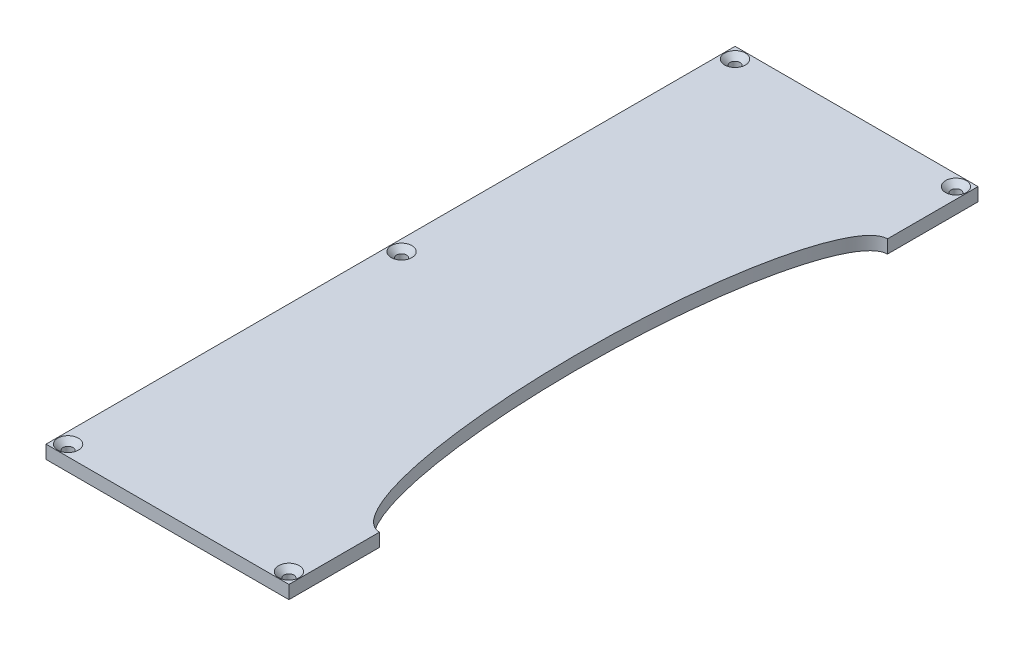
ISO-10303-21;
HEADER;
FILE_DESCRIPTION(('STEP AP214'),'2;1');
FILE_NAME('part.step','',(''),(''),'','','');
FILE_SCHEMA(('AUTOMOTIVE_DESIGN { 1 0 10303 214 1 1 1 1 }'));
ENDSEC;
DATA;
#1=APPLICATION_CONTEXT('core data for automotive mechanical design processes');
#2=APPLICATION_PROTOCOL_DEFINITION('international standard','automotive_design',2000,#1);
#3=PRODUCT_CONTEXT('',#1,'mechanical');
#4=PRODUCT('Part','Part','',(#3));
#5=PRODUCT_RELATED_PRODUCT_CATEGORY('part','',(#4));
#6=PRODUCT_DEFINITION_FORMATION('','',#4);
#7=PRODUCT_DEFINITION_CONTEXT('part definition',#1,'design');
#8=PRODUCT_DEFINITION('design','',#6,#7);
#9=PRODUCT_DEFINITION_SHAPE('','',#8);
#10=(LENGTH_UNIT() NAMED_UNIT(*) SI_UNIT(.MILLI.,.METRE.));
#11=(NAMED_UNIT(*) PLANE_ANGLE_UNIT() SI_UNIT($,.RADIAN.));
#12=(NAMED_UNIT(*) SI_UNIT($,.STERADIAN.) SOLID_ANGLE_UNIT());
#13=UNCERTAINTY_MEASURE_WITH_UNIT(LENGTH_MEASURE(1.E-05),#10,'distance_accuracy_value','');
#14=(GEOMETRIC_REPRESENTATION_CONTEXT(3) GLOBAL_UNCERTAINTY_ASSIGNED_CONTEXT((#13)) GLOBAL_UNIT_ASSIGNED_CONTEXT((#10,
#11,#12)) REPRESENTATION_CONTEXT('',''));
#15=CARTESIAN_POINT('',(0.,0.,0.));
#16=DIRECTION('',(0.,0.,1.));
#17=DIRECTION('',(1.,0.,0.));
#18=AXIS2_PLACEMENT_3D('',#15,#16,#17);
#19=CARTESIAN_POINT('',(0.,6.,0.));
#20=DIRECTION('',(0.,1.,0.));
#21=DIRECTION('',(0.,0.,-1.));
#22=AXIS2_PLACEMENT_3D('',#19,#20,#21);
#23=ELLIPSE('',#22,115.,25.);
#24=DIRECTION('',(0.,-1.,0.));
#25=VECTOR('',#24,1.);
#26=SURFACE_OF_LINEAR_EXTRUSION('',#23,#25);
#27=CARTESIAN_POINT('',(0.,0.,0.));
#28=DIRECTION('',(0.,1.,0.));
#29=DIRECTION('',(0.,0.,-1.));
#30=AXIS2_PLACEMENT_3D('',#27,#28,#29);
#31=ELLIPSE('',#30,115.,25.);
#32=CARTESIAN_POINT('',(0.,0.,-115.));
#33=VERTEX_POINT('',#32);
#34=CARTESIAN_POINT('',(0.,0.,115.));
#35=VERTEX_POINT('',#34);
#36=EDGE_CURVE('E130',#33,#35,#31,.T.);
#37=ORIENTED_EDGE('',*,*,#36,.F.);
#38=DIRECTION('',(0.,-1.,0.));
#39=VECTOR('',#38,1.);
#40=CARTESIAN_POINT('',(0.,6.,-115.));
#41=LINE('',#40,#39);
#42=CARTESIAN_POINT('',(0.,6.,-115.));
#43=VERTEX_POINT('',#42);
#44=EDGE_CURVE('E11',#43,#33,#41,.T.);
#45=ORIENTED_EDGE('',*,*,#44,.F.);
#46=CARTESIAN_POINT('',(0.,6.,115.));
#47=VERTEX_POINT('',#46);
#48=EDGE_CURVE('E148',#43,#47,#23,.T.);
#49=ORIENTED_EDGE('',*,*,#48,.T.);
#50=DIRECTION('',(0.,-1.,0.));
#51=VECTOR('',#50,1.);
#52=CARTESIAN_POINT('',(0.,6.,115.));
#53=LINE('',#52,#51);
#54=EDGE_CURVE('E90',#47,#35,#53,.T.);
#55=ORIENTED_EDGE('',*,*,#54,.T.);
#56=EDGE_LOOP('',(#37,#45,#49,#55));
#57=FACE_BOUND('',#56,.T.);
#58=ADVANCED_FACE('F41',(#57),#26,.T.);
#59=CARTESIAN_POINT('',(0.,6.,0.));
#60=DIRECTION('',(-1.,0.,0.));
#61=DIRECTION('',(0.,0.,1.));
#62=AXIS2_PLACEMENT_3D('',#59,#60,#61);
#63=PLANE('',#62);
#64=DIRECTION('',(0.,0.,-1.));
#65=VECTOR('',#64,1.);
#66=CARTESIAN_POINT('',(0.,0.,0.));
#67=LINE('',#66,#65);
#68=CARTESIAN_POINT('',(0.,0.,-156.));
#69=VERTEX_POINT('',#68);
#70=EDGE_CURVE('E134',#33,#69,#67,.T.);
#71=ORIENTED_EDGE('',*,*,#70,.T.);
#72=DIRECTION('',(0.,-1.,0.));
#73=VECTOR('',#72,1.);
#74=CARTESIAN_POINT('',(0.,6.,-156.));
#75=LINE('',#74,#73);
#76=CARTESIAN_POINT('',(0.,6.,-156.));
#77=VERTEX_POINT('',#76);
#78=EDGE_CURVE('E52',#77,#69,#75,.T.);
#79=ORIENTED_EDGE('',*,*,#78,.F.);
#80=DIRECTION('',(0.,0.,-1.));
#81=VECTOR('',#80,1.);
#82=CARTESIAN_POINT('',(0.,6.,0.));
#83=LINE('',#82,#81);
#84=EDGE_CURVE('E211',#43,#77,#83,.T.);
#85=ORIENTED_EDGE('',*,*,#84,.F.);
#86=ORIENTED_EDGE('',*,*,#44,.T.);
#87=EDGE_LOOP('',(#71,#79,#85,#86));
#88=FACE_BOUND('',#87,.T.);
#89=ADVANCED_FACE('F216',(#88),#63,.F.);
#90=CARTESIAN_POINT('',(0.,6.,-156.));
#91=DIRECTION('',(0.,0.,1.));
#92=DIRECTION('',(1.,0.,0.));
#93=AXIS2_PLACEMENT_3D('',#90,#91,#92);
#94=PLANE('',#93);
#95=DIRECTION('',(-1.,0.,0.));
#96=VECTOR('',#95,1.);
#97=CARTESIAN_POINT('',(0.,0.,-156.));
#98=LINE('',#97,#96);
#99=CARTESIAN_POINT('',(-110.,0.,-156.));
#100=VERTEX_POINT('',#99);
#101=EDGE_CURVE('E138',#69,#100,#98,.T.);
#102=ORIENTED_EDGE('',*,*,#101,.T.);
#103=DIRECTION('',(0.,-1.,0.));
#104=VECTOR('',#103,1.);
#105=CARTESIAN_POINT('',(-110.,6.,-156.));
#106=LINE('',#105,#104);
#107=CARTESIAN_POINT('',(-110.,6.,-156.));
#108=VERTEX_POINT('',#107);
#109=EDGE_CURVE('E120',#108,#100,#106,.T.);
#110=ORIENTED_EDGE('',*,*,#109,.F.);
#111=DIRECTION('',(-1.,0.,0.));
#112=VECTOR('',#111,1.);
#113=CARTESIAN_POINT('',(0.,6.,-156.));
#114=LINE('',#113,#112);
#115=EDGE_CURVE('E109',#77,#108,#114,.T.);
#116=ORIENTED_EDGE('',*,*,#115,.F.);
#117=ORIENTED_EDGE('',*,*,#78,.T.);
#118=EDGE_LOOP('',(#102,#110,#116,#117));
#119=FACE_BOUND('',#118,.T.);
#120=ADVANCED_FACE('F220',(#119),#94,.F.);
#121=CARTESIAN_POINT('',(-110.,6.,0.));
#122=DIRECTION('',(1.,0.,0.));
#123=DIRECTION('',(0.,0.,-1.));
#124=AXIS2_PLACEMENT_3D('',#121,#122,#123);
#125=PLANE('',#124);
#126=DIRECTION('',(0.,0.,1.));
#127=VECTOR('',#126,1.);
#128=CARTESIAN_POINT('',(-110.,0.,0.));
#129=LINE('',#128,#127);
#130=CARTESIAN_POINT('',(-110.,0.,156.));
#131=VERTEX_POINT('',#130);
#132=EDGE_CURVE('E118',#100,#131,#129,.T.);
#133=ORIENTED_EDGE('',*,*,#132,.T.);
#134=DIRECTION('',(0.,-1.,0.));
#135=VECTOR('',#134,1.);
#136=CARTESIAN_POINT('',(-110.,6.,156.));
#137=LINE('',#136,#135);
#138=CARTESIAN_POINT('',(-110.,6.,156.));
#139=VERTEX_POINT('',#138);
#140=EDGE_CURVE('E115',#139,#131,#137,.T.);
#141=ORIENTED_EDGE('',*,*,#140,.F.);
#142=DIRECTION('',(0.,0.,1.));
#143=VECTOR('',#142,1.);
#144=CARTESIAN_POINT('',(-110.,6.,0.));
#145=LINE('',#144,#143);
#146=EDGE_CURVE('E103',#108,#139,#145,.T.);
#147=ORIENTED_EDGE('',*,*,#146,.F.);
#148=ORIENTED_EDGE('',*,*,#109,.T.);
#149=EDGE_LOOP('',(#133,#141,#147,#148));
#150=FACE_BOUND('',#149,.T.);
#151=ADVANCED_FACE('F116',(#150),#125,.F.);
#152=CARTESIAN_POINT('',(0.,6.,156.));
#153=DIRECTION('',(0.,0.,-1.));
#154=DIRECTION('',(-1.,0.,0.));
#155=AXIS2_PLACEMENT_3D('',#152,#153,#154);
#156=PLANE('',#155);
#157=DIRECTION('',(1.,0.,0.));
#158=VECTOR('',#157,1.);
#159=CARTESIAN_POINT('',(0.,0.,156.));
#160=LINE('',#159,#158);
#161=CARTESIAN_POINT('',(0.,0.,156.));
#162=VERTEX_POINT('',#161);
#163=EDGE_CURVE('E83',#131,#162,#160,.T.);
#164=ORIENTED_EDGE('',*,*,#163,.T.);
#165=DIRECTION('',(0.,-1.,0.));
#166=VECTOR('',#165,1.);
#167=CARTESIAN_POINT('',(0.,6.,156.));
#168=LINE('',#167,#166);
#169=CARTESIAN_POINT('',(0.,6.,156.));
#170=VERTEX_POINT('',#169);
#171=EDGE_CURVE('E121',#170,#162,#168,.T.);
#172=ORIENTED_EDGE('',*,*,#171,.F.);
#173=DIRECTION('',(1.,0.,0.));
#174=VECTOR('',#173,1.);
#175=CARTESIAN_POINT('',(0.,6.,156.));
#176=LINE('',#175,#174);
#177=EDGE_CURVE('E107',#139,#170,#176,.T.);
#178=ORIENTED_EDGE('',*,*,#177,.F.);
#179=ORIENTED_EDGE('',*,*,#140,.T.);
#180=EDGE_LOOP('',(#164,#172,#178,#179));
#181=FACE_BOUND('',#180,.T.);
#182=ADVANCED_FACE('F123',(#181),#156,.F.);
#183=CARTESIAN_POINT('',(0.,6.,0.));
#184=DIRECTION('',(-1.,0.,0.));
#185=DIRECTION('',(0.,0.,1.));
#186=AXIS2_PLACEMENT_3D('',#183,#184,#185);
#187=PLANE('',#186);
#188=DIRECTION('',(0.,0.,-1.));
#189=VECTOR('',#188,1.);
#190=CARTESIAN_POINT('',(0.,0.,0.));
#191=LINE('',#190,#189);
#192=EDGE_CURVE('E145',#162,#35,#191,.T.);
#193=ORIENTED_EDGE('',*,*,#192,.T.);
#194=ORIENTED_EDGE('',*,*,#54,.F.);
#195=DIRECTION('',(0.,0.,-1.));
#196=VECTOR('',#195,1.);
#197=CARTESIAN_POINT('',(0.,6.,0.));
#198=LINE('',#197,#196);
#199=EDGE_CURVE('E61',#170,#47,#198,.T.);
#200=ORIENTED_EDGE('',*,*,#199,.F.);
#201=ORIENTED_EDGE('',*,*,#171,.T.);
#202=EDGE_LOOP('',(#193,#194,#200,#201));
#203=FACE_BOUND('',#202,.T.);
#204=ADVANCED_FACE('F225',(#203),#187,.F.);
#205=CARTESIAN_POINT('',(0.,6.,0.));
#206=DIRECTION('',(0.,1.,0.));
#207=DIRECTION('',(0.,0.,1.));
#208=AXIS2_PLACEMENT_3D('',#205,#206,#207);
#209=PLANE('',#208);
#210=CARTESIAN_POINT('',(-105.,6.,-151.));
#211=DIRECTION('',(0.,1.,0.));
#212=DIRECTION('',(0.,0.,1.));
#213=AXIS2_PLACEMENT_3D('',#210,#211,#212);
#214=CIRCLE('',#213,4.7);
#215=CARTESIAN_POINT('',(-105.,6.,-146.3));
#216=VERTEX_POINT('',#215);
#217=EDGE_CURVE('E293',#216,#216,#214,.T.);
#218=ORIENTED_EDGE('',*,*,#217,.F.);
#219=EDGE_LOOP('',(#218));
#220=FACE_BOUND('',#219,.T.);
#221=CARTESIAN_POINT('',(-5.,6.,-151.));
#222=DIRECTION('',(0.,1.,0.));
#223=DIRECTION('',(0.,0.,1.));
#224=AXIS2_PLACEMENT_3D('',#221,#222,#223);
#225=CIRCLE('',#224,4.7);
#226=CARTESIAN_POINT('',(-5.,6.,-146.3));
#227=VERTEX_POINT('',#226);
#228=EDGE_CURVE('E185',#227,#227,#225,.T.);
#229=ORIENTED_EDGE('',*,*,#228,.F.);
#230=EDGE_LOOP('',(#229));
#231=FACE_BOUND('',#230,.T.);
#232=CARTESIAN_POINT('',(-5.,6.,151.));
#233=DIRECTION('',(0.,1.,0.));
#234=DIRECTION('',(0.,0.,1.));
#235=AXIS2_PLACEMENT_3D('',#232,#233,#234);
#236=CIRCLE('',#235,4.7);
#237=CARTESIAN_POINT('',(-5.,6.,155.7));
#238=VERTEX_POINT('',#237);
#239=EDGE_CURVE('E176',#238,#238,#236,.T.);
#240=ORIENTED_EDGE('',*,*,#239,.F.);
#241=EDGE_LOOP('',(#240));
#242=FACE_BOUND('',#241,.T.);
#243=CARTESIAN_POINT('',(-105.,6.,151.));
#244=DIRECTION('',(0.,1.,0.));
#245=DIRECTION('',(0.,0.,1.));
#246=AXIS2_PLACEMENT_3D('',#243,#244,#245);
#247=CIRCLE('',#246,4.7);
#248=CARTESIAN_POINT('',(-105.,6.,155.7));
#249=VERTEX_POINT('',#248);
#250=EDGE_CURVE('E171',#249,#249,#247,.T.);
#251=ORIENTED_EDGE('',*,*,#250,.F.);
#252=EDGE_LOOP('',(#251));
#253=FACE_BOUND('',#252,.T.);
#254=CARTESIAN_POINT('',(-105.,6.,0.));
#255=DIRECTION('',(0.,1.,0.));
#256=DIRECTION('',(0.,0.,1.));
#257=AXIS2_PLACEMENT_3D('',#254,#255,#256);
#258=CIRCLE('',#257,4.7);
#259=CARTESIAN_POINT('',(-105.,6.,4.7));
#260=VERTEX_POINT('',#259);
#261=EDGE_CURVE('E166',#260,#260,#258,.T.);
#262=ORIENTED_EDGE('',*,*,#261,.F.);
#263=EDGE_LOOP('',(#262));
#264=FACE_BOUND('',#263,.T.);
#265=ORIENTED_EDGE('',*,*,#48,.F.);
#266=ORIENTED_EDGE('',*,*,#84,.T.);
#267=ORIENTED_EDGE('',*,*,#115,.T.);
#268=ORIENTED_EDGE('',*,*,#146,.T.);
#269=ORIENTED_EDGE('',*,*,#177,.T.);
#270=ORIENTED_EDGE('',*,*,#199,.T.);
#271=EDGE_LOOP('',(#265,#266,#267,#268,#269,#270));
#272=FACE_BOUND('',#271,.T.);
#273=ADVANCED_FACE('F105',(#220,#231,#242,#253,#264,#272),#209,.T.);
#274=CARTESIAN_POINT('',(0.,0.,0.));
#275=DIRECTION('',(0.,1.,0.));
#276=DIRECTION('',(0.,0.,1.));
#277=AXIS2_PLACEMENT_3D('',#274,#275,#276);
#278=PLANE('',#277);
#279=CARTESIAN_POINT('',(-105.,0.,-151.));
#280=DIRECTION('',(0.,1.,0.));
#281=DIRECTION('',(0.,0.,1.));
#282=AXIS2_PLACEMENT_3D('',#279,#280,#281);
#283=CIRCLE('',#282,2.25);
#284=CARTESIAN_POINT('',(-105.,0.,-148.75));
#285=VERTEX_POINT('',#284);
#286=EDGE_CURVE('E45',#285,#285,#283,.T.);
#287=ORIENTED_EDGE('',*,*,#286,.T.);
#288=EDGE_LOOP('',(#287));
#289=FACE_BOUND('',#288,.T.);
#290=CARTESIAN_POINT('',(-5.,0.,-151.));
#291=DIRECTION('',(0.,1.,0.));
#292=DIRECTION('',(0.,0.,1.));
#293=AXIS2_PLACEMENT_3D('',#290,#291,#292);
#294=CIRCLE('',#293,2.25);
#295=CARTESIAN_POINT('',(-5.,0.,-148.75));
#296=VERTEX_POINT('',#295);
#297=EDGE_CURVE('E173',#296,#296,#294,.T.);
#298=ORIENTED_EDGE('',*,*,#297,.T.);
#299=EDGE_LOOP('',(#298));
#300=FACE_BOUND('',#299,.T.);
#301=CARTESIAN_POINT('',(-5.,0.,151.));
#302=DIRECTION('',(0.,1.,0.));
#303=DIRECTION('',(0.,0.,1.));
#304=AXIS2_PLACEMENT_3D('',#301,#302,#303);
#305=CIRCLE('',#304,2.25);
#306=CARTESIAN_POINT('',(-5.,0.,153.25));
#307=VERTEX_POINT('',#306);
#308=EDGE_CURVE('E168',#307,#307,#305,.T.);
#309=ORIENTED_EDGE('',*,*,#308,.T.);
#310=EDGE_LOOP('',(#309));
#311=FACE_BOUND('',#310,.T.);
#312=CARTESIAN_POINT('',(-105.,0.,151.));
#313=DIRECTION('',(0.,1.,0.));
#314=DIRECTION('',(0.,0.,1.));
#315=AXIS2_PLACEMENT_3D('',#312,#313,#314);
#316=CIRCLE('',#315,2.25);
#317=CARTESIAN_POINT('',(-105.,0.,153.25));
#318=VERTEX_POINT('',#317);
#319=EDGE_CURVE('E162',#318,#318,#316,.T.);
#320=ORIENTED_EDGE('',*,*,#319,.T.);
#321=EDGE_LOOP('',(#320));
#322=FACE_BOUND('',#321,.T.);
#323=CARTESIAN_POINT('',(-105.,0.,0.));
#324=DIRECTION('',(0.,1.,0.));
#325=DIRECTION('',(0.,0.,1.));
#326=AXIS2_PLACEMENT_3D('',#323,#324,#325);
#327=CIRCLE('',#326,2.25);
#328=CARTESIAN_POINT('',(-105.,0.,2.25));
#329=VERTEX_POINT('',#328);
#330=EDGE_CURVE('E135',#329,#329,#327,.T.);
#331=ORIENTED_EDGE('',*,*,#330,.T.);
#332=EDGE_LOOP('',(#331));
#333=FACE_BOUND('',#332,.T.);
#334=ORIENTED_EDGE('',*,*,#36,.T.);
#335=ORIENTED_EDGE('',*,*,#192,.F.);
#336=ORIENTED_EDGE('',*,*,#163,.F.);
#337=ORIENTED_EDGE('',*,*,#132,.F.);
#338=ORIENTED_EDGE('',*,*,#101,.F.);
#339=ORIENTED_EDGE('',*,*,#70,.F.);
#340=EDGE_LOOP('',(#334,#335,#336,#337,#338,#339));
#341=FACE_BOUND('',#340,.T.);
#342=ADVANCED_FACE('F222',(#289,#300,#311,#322,#333,#341),#278,.F.);
#343=CARTESIAN_POINT('',(-105.,6.,0.));
#344=DIRECTION('',(0.,1.,0.));
#345=DIRECTION('',(0.,0.,1.));
#346=AXIS2_PLACEMENT_3D('',#343,#344,#345);
#347=CYLINDRICAL_SURFACE('',#346,2.25);
#348=CARTESIAN_POINT('',(-105.,3.55,0.));
#349=DIRECTION('',(0.,1.,0.));
#350=DIRECTION('',(0.,0.,1.));
#351=AXIS2_PLACEMENT_3D('',#348,#349,#350);
#352=CIRCLE('',#351,2.25);
#353=CARTESIAN_POINT('',(-105.,3.55,2.25));
#354=VERTEX_POINT('',#353);
#355=EDGE_CURVE('E161',#354,#354,#352,.T.);
#356=ORIENTED_EDGE('',*,*,#355,.T.);
#357=EDGE_LOOP('',(#356));
#358=FACE_BOUND('',#357,.T.);
#359=ORIENTED_EDGE('',*,*,#330,.F.);
#360=EDGE_LOOP('',(#359));
#361=FACE_BOUND('',#360,.T.);
#362=ADVANCED_FACE('F243',(#358,#361),#347,.F.);
#363=CARTESIAN_POINT('',(-105.,6.,0.));
#364=DIRECTION('',(0.,1.,0.));
#365=DIRECTION('',(0.,0.,1.));
#366=AXIS2_PLACEMENT_3D('',#363,#364,#365);
#367=CONICAL_SURFACE('',#366,4.7,0.785398163397447);
#368=ORIENTED_EDGE('',*,*,#355,.F.);
#369=EDGE_LOOP('',(#368));
#370=FACE_BOUND('',#369,.T.);
#371=ORIENTED_EDGE('',*,*,#261,.T.);
#372=EDGE_LOOP('',(#371));
#373=FACE_BOUND('',#372,.T.);
#374=ADVANCED_FACE('F250',(#370,#373),#367,.F.);
#375=CARTESIAN_POINT('',(-105.,6.,151.));
#376=DIRECTION('',(0.,1.,0.));
#377=DIRECTION('',(0.,0.,1.));
#378=AXIS2_PLACEMENT_3D('',#375,#376,#377);
#379=CYLINDRICAL_SURFACE('',#378,2.25);
#380=CARTESIAN_POINT('',(-105.,3.55,151.));
#381=DIRECTION('',(0.,1.,0.));
#382=DIRECTION('',(0.,0.,1.));
#383=AXIS2_PLACEMENT_3D('',#380,#381,#382);
#384=CIRCLE('',#383,2.25);
#385=CARTESIAN_POINT('',(-105.,3.55,153.25));
#386=VERTEX_POINT('',#385);
#387=EDGE_CURVE('E167',#386,#386,#384,.T.);
#388=ORIENTED_EDGE('',*,*,#387,.T.);
#389=EDGE_LOOP('',(#388));
#390=FACE_BOUND('',#389,.T.);
#391=ORIENTED_EDGE('',*,*,#319,.F.);
#392=EDGE_LOOP('',(#391));
#393=FACE_BOUND('',#392,.T.);
#394=ADVANCED_FACE('F254',(#390,#393),#379,.F.);
#395=CARTESIAN_POINT('',(-105.,6.,151.));
#396=DIRECTION('',(0.,1.,0.));
#397=DIRECTION('',(0.,0.,1.));
#398=AXIS2_PLACEMENT_3D('',#395,#396,#397);
#399=CONICAL_SURFACE('',#398,4.7,0.785398163397447);
#400=ORIENTED_EDGE('',*,*,#387,.F.);
#401=EDGE_LOOP('',(#400));
#402=FACE_BOUND('',#401,.T.);
#403=ORIENTED_EDGE('',*,*,#250,.T.);
#404=EDGE_LOOP('',(#403));
#405=FACE_BOUND('',#404,.T.);
#406=ADVANCED_FACE('F258',(#402,#405),#399,.F.);
#407=CARTESIAN_POINT('',(-5.,6.,151.));
#408=DIRECTION('',(0.,1.,0.));
#409=DIRECTION('',(0.,0.,1.));
#410=AXIS2_PLACEMENT_3D('',#407,#408,#409);
#411=CYLINDRICAL_SURFACE('',#410,2.25);
#412=CARTESIAN_POINT('',(-5.,3.55,151.));
#413=DIRECTION('',(0.,1.,0.));
#414=DIRECTION('',(0.,0.,1.));
#415=AXIS2_PLACEMENT_3D('',#412,#413,#414);
#416=CIRCLE('',#415,2.25);
#417=CARTESIAN_POINT('',(-5.,3.55,153.25));
#418=VERTEX_POINT('',#417);
#419=EDGE_CURVE('E172',#418,#418,#416,.T.);
#420=ORIENTED_EDGE('',*,*,#419,.T.);
#421=EDGE_LOOP('',(#420));
#422=FACE_BOUND('',#421,.T.);
#423=ORIENTED_EDGE('',*,*,#308,.F.);
#424=EDGE_LOOP('',(#423));
#425=FACE_BOUND('',#424,.T.);
#426=ADVANCED_FACE('F262',(#422,#425),#411,.F.);
#427=CARTESIAN_POINT('',(-5.,6.,151.));
#428=DIRECTION('',(0.,1.,0.));
#429=DIRECTION('',(0.,0.,1.));
#430=AXIS2_PLACEMENT_3D('',#427,#428,#429);
#431=CONICAL_SURFACE('',#430,4.7,0.785398163397449);
#432=ORIENTED_EDGE('',*,*,#419,.F.);
#433=EDGE_LOOP('',(#432));
#434=FACE_BOUND('',#433,.T.);
#435=ORIENTED_EDGE('',*,*,#239,.T.);
#436=EDGE_LOOP('',(#435));
#437=FACE_BOUND('',#436,.T.);
#438=ADVANCED_FACE('F266',(#434,#437),#431,.F.);
#439=CARTESIAN_POINT('',(-5.,6.,-151.));
#440=DIRECTION('',(0.,1.,0.));
#441=DIRECTION('',(0.,0.,1.));
#442=AXIS2_PLACEMENT_3D('',#439,#440,#441);
#443=CYLINDRICAL_SURFACE('',#442,2.25);
#444=CARTESIAN_POINT('',(-5.,3.55,-151.));
#445=DIRECTION('',(0.,1.,0.));
#446=DIRECTION('',(0.,0.,1.));
#447=AXIS2_PLACEMENT_3D('',#444,#445,#446);
#448=CIRCLE('',#447,2.25);
#449=CARTESIAN_POINT('',(-5.,3.55,-148.75));
#450=VERTEX_POINT('',#449);
#451=EDGE_CURVE('E177',#450,#450,#448,.T.);
#452=ORIENTED_EDGE('',*,*,#451,.T.);
#453=EDGE_LOOP('',(#452));
#454=FACE_BOUND('',#453,.T.);
#455=ORIENTED_EDGE('',*,*,#297,.F.);
#456=EDGE_LOOP('',(#455));
#457=FACE_BOUND('',#456,.T.);
#458=ADVANCED_FACE('F270',(#454,#457),#443,.F.);
#459=CARTESIAN_POINT('',(-5.,6.,-151.));
#460=DIRECTION('',(0.,1.,0.));
#461=DIRECTION('',(0.,0.,1.));
#462=AXIS2_PLACEMENT_3D('',#459,#460,#461);
#463=CONICAL_SURFACE('',#462,4.7,0.785398163397449);
#464=ORIENTED_EDGE('',*,*,#451,.F.);
#465=EDGE_LOOP('',(#464));
#466=FACE_BOUND('',#465,.T.);
#467=ORIENTED_EDGE('',*,*,#228,.T.);
#468=EDGE_LOOP('',(#467));
#469=FACE_BOUND('',#468,.T.);
#470=ADVANCED_FACE('F274',(#466,#469),#463,.F.);
#471=CARTESIAN_POINT('',(-105.,6.,-151.));
#472=DIRECTION('',(0.,1.,0.));
#473=DIRECTION('',(0.,0.,1.));
#474=AXIS2_PLACEMENT_3D('',#471,#472,#473);
#475=CYLINDRICAL_SURFACE('',#474,2.25);
#476=CARTESIAN_POINT('',(-105.,3.55,-151.));
#477=DIRECTION('',(0.,1.,0.));
#478=DIRECTION('',(0.,0.,1.));
#479=AXIS2_PLACEMENT_3D('',#476,#477,#478);
#480=CIRCLE('',#479,2.25);
#481=CARTESIAN_POINT('',(-105.,3.55,-148.75));
#482=VERTEX_POINT('',#481);
#483=EDGE_CURVE('E290',#482,#482,#480,.T.);
#484=ORIENTED_EDGE('',*,*,#483,.T.);
#485=EDGE_LOOP('',(#484));
#486=FACE_BOUND('',#485,.T.);
#487=ORIENTED_EDGE('',*,*,#286,.F.);
#488=EDGE_LOOP('',(#487));
#489=FACE_BOUND('',#488,.T.);
#490=ADVANCED_FACE('F277',(#486,#489),#475,.F.);
#491=CARTESIAN_POINT('',(-105.,6.,-151.));
#492=DIRECTION('',(0.,1.,0.));
#493=DIRECTION('',(0.,0.,1.));
#494=AXIS2_PLACEMENT_3D('',#491,#492,#493);
#495=CONICAL_SURFACE('',#494,4.7,0.785398163397447);
#496=ORIENTED_EDGE('',*,*,#483,.F.);
#497=EDGE_LOOP('',(#496));
#498=FACE_BOUND('',#497,.T.);
#499=ORIENTED_EDGE('',*,*,#217,.T.);
#500=EDGE_LOOP('',(#499));
#501=FACE_BOUND('',#500,.T.);
#502=ADVANCED_FACE('F281',(#498,#501),#495,.F.);
#503=CLOSED_SHELL('',(#58,#89,#120,#151,#182,#204,#273,#342,#362,#374,#394,#406,#426,#438,#458,
#470,#490,#502));
#504=MANIFOLD_SOLID_BREP('B2',#503);
#505=ADVANCED_BREP_SHAPE_REPRESENTATION('',(#18,#504),#14);
#506=SHAPE_DEFINITION_REPRESENTATION(#9,#505);
ENDSEC;
END-ISO-10303-21;
